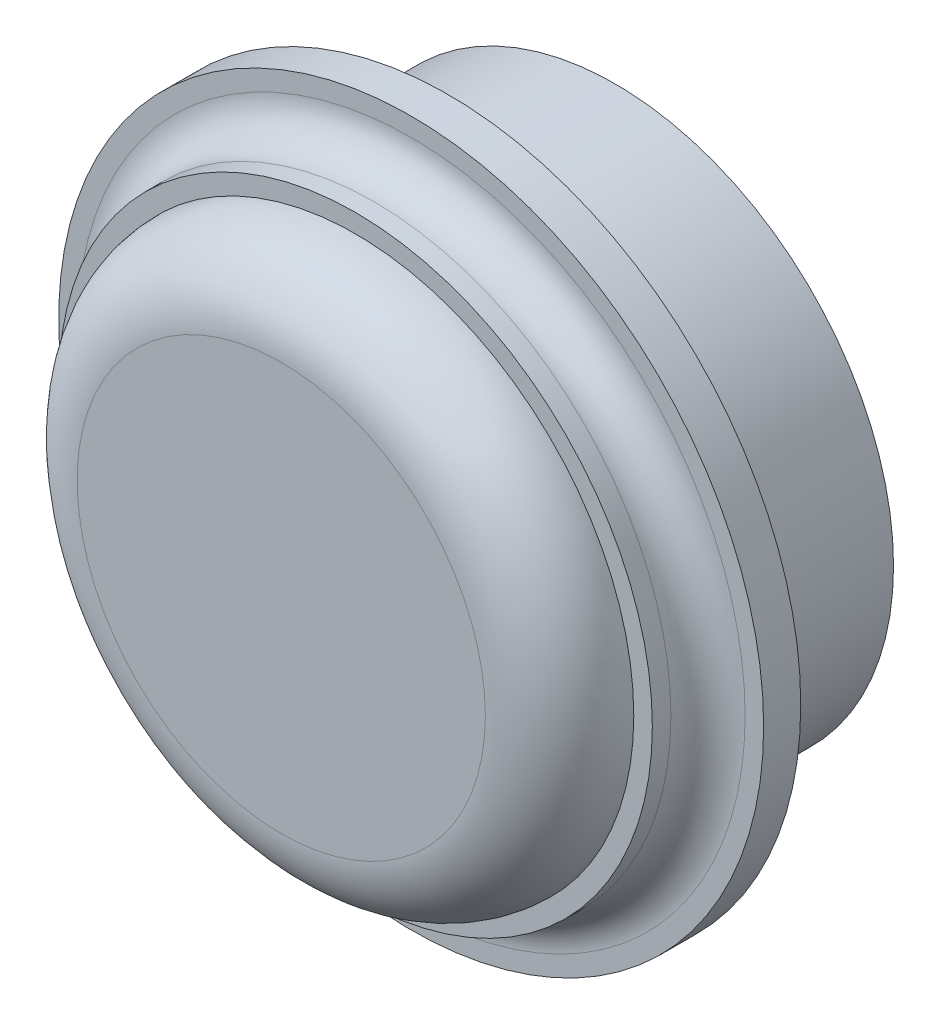
ISO-10303-21;
HEADER;
FILE_DESCRIPTION(('STEP AP214'),'2;1');
FILE_NAME('part.step','',(''),(''),'','','');
FILE_SCHEMA(('AUTOMOTIVE_DESIGN { 1 0 10303 214 1 1 1 1 }'));
ENDSEC;
DATA;
#1=APPLICATION_CONTEXT('core data for automotive mechanical design processes');
#2=APPLICATION_PROTOCOL_DEFINITION('international standard','automotive_design',2000,#1);
#3=PRODUCT_CONTEXT('',#1,'mechanical');
#4=PRODUCT('Part','Part','',(#3));
#5=PRODUCT_RELATED_PRODUCT_CATEGORY('part','',(#4));
#6=PRODUCT_DEFINITION_FORMATION('','',#4);
#7=PRODUCT_DEFINITION_CONTEXT('part definition',#1,'design');
#8=PRODUCT_DEFINITION('design','',#6,#7);
#9=PRODUCT_DEFINITION_SHAPE('','',#8);
#10=(LENGTH_UNIT() NAMED_UNIT(*) SI_UNIT(.MILLI.,.METRE.));
#11=(NAMED_UNIT(*) PLANE_ANGLE_UNIT() SI_UNIT($,.RADIAN.));
#12=(NAMED_UNIT(*) SI_UNIT($,.STERADIAN.) SOLID_ANGLE_UNIT());
#13=UNCERTAINTY_MEASURE_WITH_UNIT(LENGTH_MEASURE(1.E-05),#10,'distance_accuracy_value','');
#14=(GEOMETRIC_REPRESENTATION_CONTEXT(3) GLOBAL_UNCERTAINTY_ASSIGNED_CONTEXT((#13)) GLOBAL_UNIT_ASSIGNED_CONTEXT((#10,
#11,#12)) REPRESENTATION_CONTEXT('',''));
#15=CARTESIAN_POINT('',(0.,0.,0.));
#16=DIRECTION('',(0.,0.,1.));
#17=DIRECTION('',(1.,0.,0.));
#18=AXIS2_PLACEMENT_3D('',#15,#16,#17);
#19=CARTESIAN_POINT('',(0.,0.,-45.));
#20=DIRECTION('',(0.,0.,1.));
#21=DIRECTION('',(1.,0.,0.));
#22=AXIS2_PLACEMENT_3D('',#19,#20,#21);
#23=CYLINDRICAL_SURFACE('',#22,75.);
#24=CARTESIAN_POINT('',(0.,0.,-45.));
#25=DIRECTION('',(0.,0.,1.));
#26=DIRECTION('',(1.,0.,0.));
#27=AXIS2_PLACEMENT_3D('',#24,#25,#26);
#28=CIRCLE('',#27,75.);
#29=CARTESIAN_POINT('',(75.,0.,-45.));
#30=VERTEX_POINT('',#29);
#31=EDGE_CURVE('E11',#30,#30,#28,.T.);
#32=CARTESIAN_POINT('',(0.,0.,0.));
#33=DIRECTION('',(0.,0.,1.));
#34=DIRECTION('',(1.,0.,0.));
#35=AXIS2_PLACEMENT_3D('',#32,#33,#34);
#36=CIRCLE('',#35,75.);
#37=CARTESIAN_POINT('',(75.,0.,0.));
#38=VERTEX_POINT('',#37);
#39=EDGE_CURVE('E53',#38,#38,#36,.T.);
#40=CARTESIAN_POINT('',(75.,0.,-45.));
#41=CARTESIAN_POINT('',(75.,0.,-44.53125));
#42=CARTESIAN_POINT('',(75.,0.,-44.0625));
#43=CARTESIAN_POINT('',(75.,0.,-43.125));
#44=CARTESIAN_POINT('',(75.,0.,-42.65625));
#45=CARTESIAN_POINT('',(75.,0.,-41.71875));
#46=CARTESIAN_POINT('',(75.,0.,-41.25));
#47=CARTESIAN_POINT('',(75.,0.,-40.3125));
#48=CARTESIAN_POINT('',(75.,0.,-39.84375));
#49=CARTESIAN_POINT('',(75.,0.,-38.90625));
#50=CARTESIAN_POINT('',(75.,0.,-38.4375));
#51=CARTESIAN_POINT('',(75.,0.,-37.5));
#52=CARTESIAN_POINT('',(75.,0.,-37.03125));
#53=CARTESIAN_POINT('',(75.,0.,-36.09375));
#54=CARTESIAN_POINT('',(75.,0.,-35.625));
#55=CARTESIAN_POINT('',(75.,0.,-34.6875));
#56=CARTESIAN_POINT('',(75.,0.,-34.21875));
#57=CARTESIAN_POINT('',(75.,0.,-33.28125));
#58=CARTESIAN_POINT('',(75.,0.,-32.8125));
#59=CARTESIAN_POINT('',(75.,0.,-31.875));
#60=CARTESIAN_POINT('',(75.,0.,-31.40625));
#61=CARTESIAN_POINT('',(75.,0.,-30.46875));
#62=CARTESIAN_POINT('',(75.,0.,-30.));
#63=CARTESIAN_POINT('',(75.,0.,-29.0625));
#64=CARTESIAN_POINT('',(75.,0.,-28.59375));
#65=CARTESIAN_POINT('',(75.,0.,-27.65625));
#66=CARTESIAN_POINT('',(75.,0.,-27.1875));
#67=CARTESIAN_POINT('',(75.,0.,-26.25));
#68=CARTESIAN_POINT('',(75.,0.,-25.78125));
#69=CARTESIAN_POINT('',(75.,0.,-24.84375));
#70=CARTESIAN_POINT('',(75.,0.,-24.375));
#71=CARTESIAN_POINT('',(75.,0.,-23.4375));
#72=CARTESIAN_POINT('',(75.,0.,-22.96875));
#73=CARTESIAN_POINT('',(75.,0.,-22.03125));
#74=CARTESIAN_POINT('',(75.,0.,-21.5625));
#75=CARTESIAN_POINT('',(75.,0.,-20.625));
#76=CARTESIAN_POINT('',(75.,0.,-20.15625));
#77=CARTESIAN_POINT('',(75.,0.,-19.21875));
#78=CARTESIAN_POINT('',(75.,0.,-18.75));
#79=CARTESIAN_POINT('',(75.,0.,-17.8125));
#80=CARTESIAN_POINT('',(75.,0.,-17.34375));
#81=CARTESIAN_POINT('',(75.,0.,-16.40625));
#82=CARTESIAN_POINT('',(75.,0.,-15.9375));
#83=CARTESIAN_POINT('',(75.,0.,-15.));
#84=CARTESIAN_POINT('',(75.,0.,-14.53125));
#85=CARTESIAN_POINT('',(75.,0.,-13.59375));
#86=CARTESIAN_POINT('',(75.,0.,-13.125));
#87=CARTESIAN_POINT('',(75.,0.,-12.1875));
#88=CARTESIAN_POINT('',(75.,0.,-11.71875));
#89=CARTESIAN_POINT('',(75.,0.,-10.78125));
#90=CARTESIAN_POINT('',(75.,0.,-10.3125));
#91=CARTESIAN_POINT('',(75.,0.,-9.375));
#92=CARTESIAN_POINT('',(75.,0.,-8.90625));
#93=CARTESIAN_POINT('',(75.,0.,-7.96875));
#94=CARTESIAN_POINT('',(75.,0.,-7.5));
#95=CARTESIAN_POINT('',(75.,0.,-6.5625));
#96=CARTESIAN_POINT('',(75.,0.,-6.09375));
#97=CARTESIAN_POINT('',(75.,0.,-5.15625));
#98=CARTESIAN_POINT('',(75.,0.,-4.6875));
#99=CARTESIAN_POINT('',(75.,0.,-3.75));
#100=CARTESIAN_POINT('',(75.,0.,-3.28125));
#101=CARTESIAN_POINT('',(75.,0.,-2.34375));
#102=CARTESIAN_POINT('',(75.,0.,-1.875));
#103=CARTESIAN_POINT('',(75.,0.,-0.937499999999999));
#104=CARTESIAN_POINT('',(75.,0.,-0.46875));
#105=CARTESIAN_POINT('',(75.,0.,0.));
#106=B_SPLINE_CURVE_WITH_KNOTS('',3,(#40,#41,#42,#43,#44,#45,#46,#47,#48,#49,#50,#51,#52,#53,
#54,#55,#56,#57,#58,#59,#60,#61,#62,#63,#64,#65,#66,#67,#68,#69,#70,#71,#72,#73,#74,#75,#76,#77,
#78,#79,#80,#81,#82,#83,#84,#85,#86,#87,#88,#89,#90,#91,#92,#93,#94,#95,#96,#97,#98,#99,#100,
#101,#102,#103,#104,#105),.UNSPECIFIED.,.F.,.F.,(4,2,2,2,2,2,2,2,2,2,2,2,2,2,2,2,2,2,2,2,2,2,2,
2,2,2,2,2,2,2,2,2,4),(0.,1.40625,2.8125,4.21875,5.625,7.03125,8.43749999999999,9.84375,11.25,
12.65625,14.0625,15.46875,16.875,18.28125,19.6875,21.09375,22.5,23.90625,25.3125,26.71875,
28.125,29.53125,30.9375,32.34375,33.75,35.15625,36.5625,37.96875,39.375,40.78125,42.1875,
43.59375,45.),.UNSPECIFIED.);
#107=EDGE_CURVE('BSEAM50',#30,#38,#106,.T.);
#108=ORIENTED_EDGE('',*,*,#31,.T.);
#109=ORIENTED_EDGE('',*,*,#39,.F.);
#110=ORIENTED_EDGE('',*,*,#107,.T.);
#111=ORIENTED_EDGE('',*,*,#107,.F.);
#112=EDGE_LOOP('',(#108,#110,#109,#111));
#113=FACE_BOUND('',#112,.T.);
#114=ADVANCED_FACE('F50',(#113),#23,.T.);
#115=CARTESIAN_POINT('',(0.,0.,-45.));
#116=DIRECTION('',(0.,0.,1.));
#117=DIRECTION('',(1.,0.,0.));
#118=AXIS2_PLACEMENT_3D('',#115,#116,#117);
#119=PLANE('',#118);
#120=ORIENTED_EDGE('',*,*,#31,.F.);
#121=EDGE_LOOP('',(#120));
#122=FACE_BOUND('',#121,.T.);
#123=ADVANCED_FACE('F67',(#122),#119,.F.);
#124=CARTESIAN_POINT('',(0.,0.,0.));
#125=DIRECTION('',(0.,0.,1.));
#126=DIRECTION('',(1.,0.,0.));
#127=AXIS2_PLACEMENT_3D('',#124,#125,#126);
#128=PLANE('',#127);
#129=ORIENTED_EDGE('',*,*,#39,.T.);
#130=EDGE_LOOP('',(#129));
#131=FACE_BOUND('',#130,.T.);
#132=ADVANCED_FACE('F64',(#131),#128,.T.);
#133=CLOSED_SHELL('',(#114,#123,#132));
#134=MANIFOLD_SOLID_BREP('B2',#133);
#135=CARTESIAN_POINT('',(0.,0.,45.));
#136=DIRECTION('',(0.,0.,-1.));
#137=DIRECTION('',(-1.,0.,0.));
#138=AXIS2_PLACEMENT_3D('',#135,#136,#137);
#139=CYLINDRICAL_SURFACE('',#138,75.);
#140=CARTESIAN_POINT('',(0.,0.,25.));
#141=DIRECTION('',(0.,0.,1.));
#142=DIRECTION('',(1.,0.,0.));
#143=AXIS2_PLACEMENT_3D('',#140,#141,#142);
#144=CIRCLE('',#143,75.);
#145=CARTESIAN_POINT('',(-75.,0.,25.));
#146=VERTEX_POINT('',#145);
#147=EDGE_CURVE('E49',#146,#146,#144,.F.);
#148=CARTESIAN_POINT('',(0.,0.,0.));
#149=DIRECTION('',(0.,0.,1.));
#150=DIRECTION('',(1.,0.,0.));
#151=AXIS2_PLACEMENT_3D('',#148,#149,#150);
#152=CIRCLE('',#151,75.);
#153=CARTESIAN_POINT('',(-75.,0.,0.));
#154=VERTEX_POINT('',#153);
#155=EDGE_CURVE('E117',#154,#154,#152,.T.);
#156=CARTESIAN_POINT('',(-75.,0.,25.));
#157=CARTESIAN_POINT('',(-75.,0.,24.7395833333333));
#158=CARTESIAN_POINT('',(-75.,0.,24.4791666666667));
#159=CARTESIAN_POINT('',(-75.,0.,23.9583333333333));
#160=CARTESIAN_POINT('',(-75.,0.,23.6979166666667));
#161=CARTESIAN_POINT('',(-75.,0.,23.1770833333333));
#162=CARTESIAN_POINT('',(-75.,0.,22.9166666666667));
#163=CARTESIAN_POINT('',(-75.,0.,22.3958333333333));
#164=CARTESIAN_POINT('',(-75.,0.,22.1354166666667));
#165=CARTESIAN_POINT('',(-75.,0.,21.6145833333333));
#166=CARTESIAN_POINT('',(-75.,0.,21.3541666666667));
#167=CARTESIAN_POINT('',(-75.,0.,20.8333333333333));
#168=CARTESIAN_POINT('',(-75.,0.,20.5729166666667));
#169=CARTESIAN_POINT('',(-75.,0.,20.0520833333333));
#170=CARTESIAN_POINT('',(-75.,0.,19.7916666666667));
#171=CARTESIAN_POINT('',(-75.,0.,19.2708333333333));
#172=CARTESIAN_POINT('',(-75.,0.,19.0104166666667));
#173=CARTESIAN_POINT('',(-75.,0.,18.4895833333333));
#174=CARTESIAN_POINT('',(-75.,0.,18.2291666666667));
#175=CARTESIAN_POINT('',(-75.,0.,17.7083333333333));
#176=CARTESIAN_POINT('',(-75.,0.,17.4479166666667));
#177=CARTESIAN_POINT('',(-75.,0.,16.9270833333333));
#178=CARTESIAN_POINT('',(-75.,0.,16.6666666666667));
#179=CARTESIAN_POINT('',(-75.,0.,16.1458333333333));
#180=CARTESIAN_POINT('',(-75.,0.,15.8854166666667));
#181=CARTESIAN_POINT('',(-75.,0.,15.3645833333333));
#182=CARTESIAN_POINT('',(-75.,0.,15.1041666666667));
#183=CARTESIAN_POINT('',(-75.,0.,14.5833333333333));
#184=CARTESIAN_POINT('',(-75.,0.,14.3229166666667));
#185=CARTESIAN_POINT('',(-75.,0.,13.8020833333333));
#186=CARTESIAN_POINT('',(-75.,0.,13.5416666666667));
#187=CARTESIAN_POINT('',(-75.,0.,13.0208333333333));
#188=CARTESIAN_POINT('',(-75.,0.,12.7604166666667));
#189=CARTESIAN_POINT('',(-75.,0.,12.2395833333333));
#190=CARTESIAN_POINT('',(-75.,0.,11.9791666666667));
#191=CARTESIAN_POINT('',(-75.,0.,11.4583333333333));
#192=CARTESIAN_POINT('',(-75.,0.,11.1979166666667));
#193=CARTESIAN_POINT('',(-75.,0.,10.6770833333333));
#194=CARTESIAN_POINT('',(-75.,0.,10.4166666666667));
#195=CARTESIAN_POINT('',(-75.,0.,9.89583333333333));
#196=CARTESIAN_POINT('',(-75.,0.,9.63541666666667));
#197=CARTESIAN_POINT('',(-75.,0.,9.11458333333333));
#198=CARTESIAN_POINT('',(-75.,0.,8.85416666666666));
#199=CARTESIAN_POINT('',(-75.,0.,8.33333333333333));
#200=CARTESIAN_POINT('',(-75.,0.,8.07291666666667));
#201=CARTESIAN_POINT('',(-75.,0.,7.55208333333333));
#202=CARTESIAN_POINT('',(-75.,0.,7.29166666666667));
#203=CARTESIAN_POINT('',(-75.,0.,6.77083333333333));
#204=CARTESIAN_POINT('',(-75.,0.,6.51041666666667));
#205=CARTESIAN_POINT('',(-75.,0.,5.98958333333333));
#206=CARTESIAN_POINT('',(-75.,0.,5.72916666666667));
#207=CARTESIAN_POINT('',(-75.,0.,5.20833333333333));
#208=CARTESIAN_POINT('',(-75.,0.,4.94791666666667));
#209=CARTESIAN_POINT('',(-75.,0.,4.42708333333333));
#210=CARTESIAN_POINT('',(-75.,0.,4.16666666666667));
#211=CARTESIAN_POINT('',(-75.,0.,3.64583333333333));
#212=CARTESIAN_POINT('',(-75.,0.,3.38541666666667));
#213=CARTESIAN_POINT('',(-75.,0.,2.86458333333333));
#214=CARTESIAN_POINT('',(-75.,0.,2.60416666666667));
#215=CARTESIAN_POINT('',(-75.,0.,2.08333333333333));
#216=CARTESIAN_POINT('',(-75.,0.,1.82291666666667));
#217=CARTESIAN_POINT('',(-75.,0.,1.30208333333333));
#218=CARTESIAN_POINT('',(-75.,0.,1.04166666666667));
#219=CARTESIAN_POINT('',(-75.,0.,0.520833333333331));
#220=CARTESIAN_POINT('',(-75.,0.,0.260416666666666));
#221=CARTESIAN_POINT('',(-75.,0.,0.));
#222=B_SPLINE_CURVE_WITH_KNOTS('',3,(#156,#157,#158,#159,#160,#161,#162,#163,#164,#165,#166,
#167,#168,#169,#170,#171,#172,#173,#174,#175,#176,#177,#178,#179,#180,#181,#182,#183,#184,#185,
#186,#187,#188,#189,#190,#191,#192,#193,#194,#195,#196,#197,#198,#199,#200,#201,#202,#203,#204,
#205,#206,#207,#208,#209,#210,#211,#212,#213,#214,#215,#216,#217,#218,#219,#220,#221),
.UNSPECIFIED.,.F.,.F.,(4,2,2,2,2,2,2,2,2,2,2,2,2,2,2,2,2,2,2,2,2,2,2,2,2,2,2,2,2,2,2,2,4),(0.,
0.781250000000001,1.5625,2.34375,3.125,3.90625,4.6875,5.46875,6.25,7.03125,7.8125,8.59375,9.375,
10.15625,10.9375,11.71875,12.5,13.28125,14.0625,14.84375,15.625,16.40625,17.1875,17.96875,18.75,
19.53125,20.3125,21.09375,21.875,22.65625,23.4375,24.21875,25.),.UNSPECIFIED.);
#223=EDGE_CURVE('BSEAM106',#146,#154,#222,.T.);
#224=ORIENTED_EDGE('',*,*,#147,.T.);
#225=ORIENTED_EDGE('',*,*,#155,.T.);
#226=ORIENTED_EDGE('',*,*,#223,.T.);
#227=ORIENTED_EDGE('',*,*,#223,.F.);
#228=EDGE_LOOP('',(#224,#226,#225,#227));
#229=FACE_BOUND('',#228,.T.);
#230=ADVANCED_FACE('F106',(#229),#139,.T.);
#231=CARTESIAN_POINT('',(0.,0.,45.));
#232=DIRECTION('',(0.,0.,1.));
#233=DIRECTION('',(1.,0.,0.));
#234=AXIS2_PLACEMENT_3D('',#231,#232,#233);
#235=PLANE('',#234);
#236=CARTESIAN_POINT('',(0.,0.,45.));
#237=DIRECTION('',(0.,0.,1.));
#238=DIRECTION('',(1.,0.,0.));
#239=AXIS2_PLACEMENT_3D('',#236,#237,#238);
#240=CIRCLE('',#239,55.);
#241=CARTESIAN_POINT('',(55.,0.,45.));
#242=VERTEX_POINT('',#241);
#243=EDGE_CURVE('E113',#242,#242,#240,.T.);
#244=ORIENTED_EDGE('',*,*,#243,.T.);
#245=EDGE_LOOP('',(#244));
#246=FACE_BOUND('',#245,.T.);
#247=ADVANCED_FACE('F127',(#246),#235,.T.);
#248=CARTESIAN_POINT('',(0.,0.,0.));
#249=DIRECTION('',(0.,0.,1.));
#250=DIRECTION('',(1.,0.,0.));
#251=AXIS2_PLACEMENT_3D('',#248,#249,#250);
#252=PLANE('',#251);
#253=ORIENTED_EDGE('',*,*,#155,.F.);
#254=EDGE_LOOP('',(#253));
#255=FACE_BOUND('',#254,.T.);
#256=ADVANCED_FACE('F125',(#255),#252,.F.);
#257=CARTESIAN_POINT('',(0.,0.,25.));
#258=DIRECTION('',(0.,0.,1.));
#259=DIRECTION('',(1.,0.,0.));
#260=AXIS2_PLACEMENT_3D('',#257,#258,#259);
#261=TOROIDAL_SURFACE('',#260,55.,20.);
#262=ORIENTED_EDGE('',*,*,#147,.F.);
#263=EDGE_LOOP('',(#262));
#264=FACE_BOUND('',#263,.T.);
#265=ORIENTED_EDGE('',*,*,#243,.F.);
#266=EDGE_LOOP('',(#265));
#267=FACE_BOUND('',#266,.T.);
#268=ADVANCED_FACE('F108',(#264,#267),#261,.T.);
#269=CLOSED_SHELL('',(#230,#247,#256,#268));
#270=MANIFOLD_SOLID_BREP('B6',#269);
#271=CARTESIAN_POINT('',(0.,0.,10.));
#272=DIRECTION('',(0.,0.,1.));
#273=DIRECTION('',(1.,0.,0.));
#274=AXIS2_PLACEMENT_3D('',#271,#272,#273);
#275=PLANE('',#274);
#276=CARTESIAN_POINT('',(0.,0.,10.));
#277=DIRECTION('',(0.,0.,1.));
#278=DIRECTION('',(1.,0.,0.));
#279=AXIS2_PLACEMENT_3D('',#276,#277,#278);
#280=CIRCLE('',#279,90.);
#281=CARTESIAN_POINT('',(90.,0.,10.));
#282=VERTEX_POINT('',#281);
#283=EDGE_CURVE('E105',#282,#282,#280,.F.);
#284=ORIENTED_EDGE('',*,*,#283,.T.);
#285=EDGE_LOOP('',(#284));
#286=FACE_BOUND('',#285,.T.);
#287=CARTESIAN_POINT('',(0.,0.,10.));
#288=DIRECTION('',(0.,0.,1.));
#289=DIRECTION('',(1.,0.,0.));
#290=AXIS2_PLACEMENT_3D('',#287,#288,#289);
#291=CIRCLE('',#290,95.);
#292=CARTESIAN_POINT('',(95.,0.,10.));
#293=VERTEX_POINT('',#292);
#294=EDGE_CURVE('E173',#293,#293,#291,.T.);
#295=ORIENTED_EDGE('',*,*,#294,.T.);
#296=EDGE_LOOP('',(#295));
#297=FACE_BOUND('',#296,.T.);
#298=ADVANCED_FACE('F162',(#286,#297),#275,.T.);
#299=CARTESIAN_POINT('',(0.,0.,0.));
#300=DIRECTION('',(0.,0.,1.));
#301=DIRECTION('',(1.,0.,0.));
#302=AXIS2_PLACEMENT_3D('',#299,#300,#301);
#303=PLANE('',#302);
#304=CARTESIAN_POINT('',(0.,0.,0.));
#305=DIRECTION('',(0.,0.,1.));
#306=DIRECTION('',(1.,0.,0.));
#307=AXIS2_PLACEMENT_3D('',#304,#305,#306);
#308=CIRCLE('',#307,95.);
#309=CARTESIAN_POINT('',(95.,0.,0.));
#310=VERTEX_POINT('',#309);
#311=EDGE_CURVE('E177',#310,#310,#308,.T.);
#312=ORIENTED_EDGE('',*,*,#311,.F.);
#313=EDGE_LOOP('',(#312));
#314=FACE_BOUND('',#313,.T.);
#315=CARTESIAN_POINT('',(0.,0.,0.));
#316=DIRECTION('',(0.,0.,1.));
#317=DIRECTION('',(1.,0.,0.));
#318=AXIS2_PLACEMENT_3D('',#315,#316,#317);
#319=CIRCLE('',#318,75.);
#320=CARTESIAN_POINT('',(75.,0.,0.));
#321=VERTEX_POINT('',#320);
#322=EDGE_CURVE('E181',#321,#321,#319,.T.);
#323=ORIENTED_EDGE('',*,*,#322,.T.);
#324=EDGE_LOOP('',(#323));
#325=FACE_BOUND('',#324,.T.);
#326=ADVANCED_FACE('F206',(#314,#325),#303,.F.);
#327=CARTESIAN_POINT('',(0.,0.,10.));
#328=DIRECTION('',(0.,0.,-1.));
#329=DIRECTION('',(-1.,0.,0.));
#330=AXIS2_PLACEMENT_3D('',#327,#328,#329);
#331=CYLINDRICAL_SURFACE('',#330,95.);
#332=ORIENTED_EDGE('',*,*,#294,.F.);
#333=EDGE_LOOP('',(#332));
#334=FACE_BOUND('',#333,.T.);
#335=ORIENTED_EDGE('',*,*,#311,.T.);
#336=EDGE_LOOP('',(#335));
#337=FACE_BOUND('',#336,.T.);
#338=ADVANCED_FACE('F211',(#334,#337),#331,.T.);
#339=CARTESIAN_POINT('',(0.,0.,10.));
#340=DIRECTION('',(0.,0.,-1.));
#341=DIRECTION('',(-1.,0.,0.));
#342=AXIS2_PLACEMENT_3D('',#339,#340,#341);
#343=CYLINDRICAL_SURFACE('',#342,75.);
#344=ORIENTED_EDGE('',*,*,#322,.F.);
#345=EDGE_LOOP('',(#344));
#346=FACE_BOUND('',#345,.T.);
#347=CARTESIAN_POINT('',(0.,0.,25.));
#348=DIRECTION('',(0.,0.,1.));
#349=DIRECTION('',(1.,0.,0.));
#350=AXIS2_PLACEMENT_3D('',#347,#348,#349);
#351=CIRCLE('',#350,75.);
#352=CARTESIAN_POINT('',(75.,0.,25.));
#353=VERTEX_POINT('',#352);
#354=EDGE_CURVE('E186',#353,#353,#351,.T.);
#355=ORIENTED_EDGE('',*,*,#354,.T.);
#356=EDGE_LOOP('',(#355));
#357=FACE_BOUND('',#356,.T.);
#358=ADVANCED_FACE('F203',(#346,#357),#343,.F.);
#359=CARTESIAN_POINT('',(0.,0.,25.));
#360=DIRECTION('',(0.,0.,-1.));
#361=DIRECTION('',(-1.,0.,0.));
#362=AXIS2_PLACEMENT_3D('',#359,#360,#361);
#363=PLANE('',#362);
#364=CARTESIAN_POINT('',(0.,0.,25.));
#365=DIRECTION('',(0.,0.,1.));
#366=DIRECTION('',(1.,0.,0.));
#367=AXIS2_PLACEMENT_3D('',#364,#365,#366);
#368=CIRCLE('',#367,80.);
#369=CARTESIAN_POINT('',(80.,0.,25.));
#370=VERTEX_POINT('',#369);
#371=EDGE_CURVE('E185',#370,#370,#368,.T.);
#372=ORIENTED_EDGE('',*,*,#371,.T.);
#373=EDGE_LOOP('',(#372));
#374=FACE_BOUND('',#373,.T.);
#375=ORIENTED_EDGE('',*,*,#354,.F.);
#376=EDGE_LOOP('',(#375));
#377=FACE_BOUND('',#376,.T.);
#378=ADVANCED_FACE('F192',(#374,#377),#363,.F.);
#379=CARTESIAN_POINT('',(0.,0.,10.));
#380=DIRECTION('',(0.,0.,1.));
#381=DIRECTION('',(1.,0.,0.));
#382=AXIS2_PLACEMENT_3D('',#379,#380,#381);
#383=CYLINDRICAL_SURFACE('',#382,80.);
#384=CARTESIAN_POINT('',(0.,0.,20.));
#385=DIRECTION('',(0.,0.,1.));
#386=DIRECTION('',(1.,0.,0.));
#387=AXIS2_PLACEMENT_3D('',#384,#385,#386);
#388=CIRCLE('',#387,80.);
#389=CARTESIAN_POINT('',(80.,0.,20.));
#390=VERTEX_POINT('',#389);
#391=EDGE_CURVE('E169',#390,#390,#388,.T.);
#392=ORIENTED_EDGE('',*,*,#391,.T.);
#393=EDGE_LOOP('',(#392));
#394=FACE_BOUND('',#393,.T.);
#395=ORIENTED_EDGE('',*,*,#371,.F.);
#396=EDGE_LOOP('',(#395));
#397=FACE_BOUND('',#396,.T.);
#398=ADVANCED_FACE('F195',(#394,#397),#383,.T.);
#399=CARTESIAN_POINT('',(0.,0.,20.));
#400=DIRECTION('',(0.,0.,1.));
#401=DIRECTION('',(1.,0.,0.));
#402=AXIS2_PLACEMENT_3D('',#399,#400,#401);
#403=TOROIDAL_SURFACE('',#402,90.,10.);
#404=ORIENTED_EDGE('',*,*,#283,.F.);
#405=EDGE_LOOP('',(#404));
#406=FACE_BOUND('',#405,.T.);
#407=ORIENTED_EDGE('',*,*,#391,.F.);
#408=EDGE_LOOP('',(#407));
#409=FACE_BOUND('',#408,.T.);
#410=ADVANCED_FACE('F164',(#406,#409),#403,.F.);
#411=CLOSED_SHELL('',(#298,#326,#338,#358,#378,#398,#410));
#412=MANIFOLD_SOLID_BREP('B44',#411);
#413=ADVANCED_BREP_SHAPE_REPRESENTATION('',(#18,#134,#270,#412),#14);
#414=SHAPE_DEFINITION_REPRESENTATION(#9,#413);
ENDSEC;
END-ISO-10303-21;
